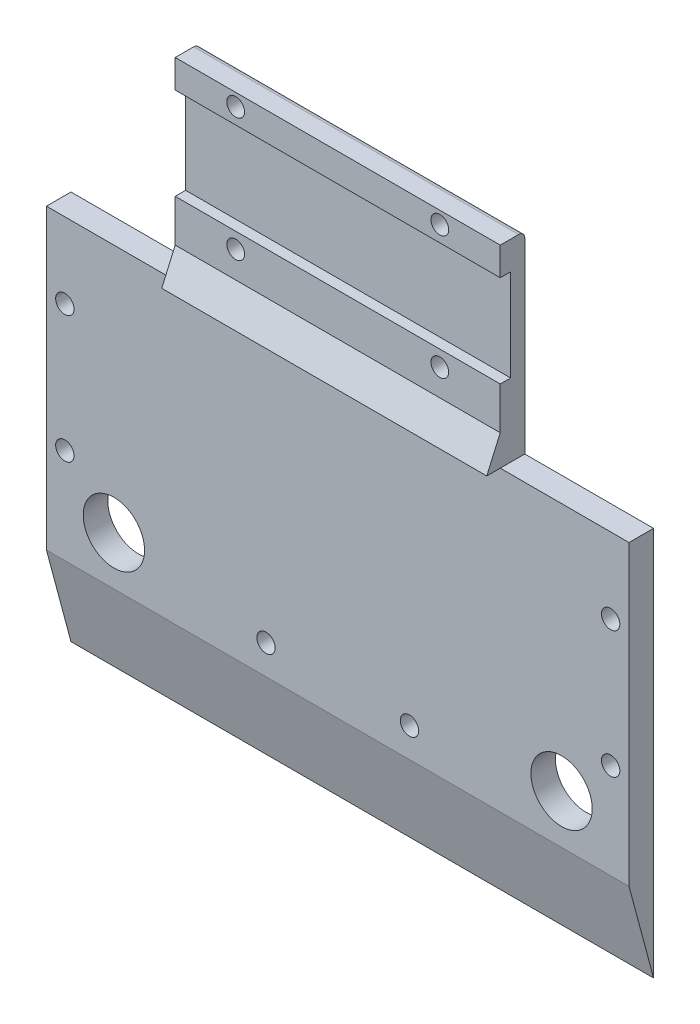
ISO-10303-21;
HEADER;
FILE_DESCRIPTION(('STEP AP214'),'2;1');
FILE_NAME('part.step','',(''),(''),'','','');
FILE_SCHEMA(('AUTOMOTIVE_DESIGN { 1 0 10303 214 1 1 1 1 }'));
ENDSEC;
DATA;
#1=APPLICATION_CONTEXT('core data for automotive mechanical design processes');
#2=APPLICATION_PROTOCOL_DEFINITION('international standard','automotive_design',2000,#1);
#3=PRODUCT_CONTEXT('',#1,'mechanical');
#4=PRODUCT('Part','Part','',(#3));
#5=PRODUCT_RELATED_PRODUCT_CATEGORY('part','',(#4));
#6=PRODUCT_DEFINITION_FORMATION('','',#4);
#7=PRODUCT_DEFINITION_CONTEXT('part definition',#1,'design');
#8=PRODUCT_DEFINITION('design','',#6,#7);
#9=PRODUCT_DEFINITION_SHAPE('','',#8);
#10=(LENGTH_UNIT() NAMED_UNIT(*) SI_UNIT(.MILLI.,.METRE.));
#11=(NAMED_UNIT(*) PLANE_ANGLE_UNIT() SI_UNIT($,.RADIAN.));
#12=(NAMED_UNIT(*) SI_UNIT($,.STERADIAN.) SOLID_ANGLE_UNIT());
#13=UNCERTAINTY_MEASURE_WITH_UNIT(LENGTH_MEASURE(1.E-05),#10,'distance_accuracy_value','');
#14=(GEOMETRIC_REPRESENTATION_CONTEXT(3) GLOBAL_UNCERTAINTY_ASSIGNED_CONTEXT((#13)) GLOBAL_UNIT_ASSIGNED_CONTEXT((#10,
#11,#12)) REPRESENTATION_CONTEXT('',''));
#15=CARTESIAN_POINT('',(0.,0.,0.));
#16=DIRECTION('',(0.,0.,1.));
#17=DIRECTION('',(1.,0.,0.));
#18=AXIS2_PLACEMENT_3D('',#15,#16,#17);
#19=CARTESIAN_POINT('',(0.,0.,4.));
#20=DIRECTION('',(0.,0.,1.));
#21=DIRECTION('',(1.,0.,0.));
#22=AXIS2_PLACEMENT_3D('',#19,#20,#21);
#23=PLANE('',#22);
#24=CARTESIAN_POINT('',(12.2768575673469,-46.5235823702513,4.));
#25=DIRECTION('',(0.,0.,1.));
#26=DIRECTION('',(1.,0.,0.));
#27=AXIS2_PLACEMENT_3D('',#24,#25,#26);
#28=CIRCLE('',#27,1.5);
#29=CARTESIAN_POINT('',(13.7768575673469,-46.5235823702513,4.));
#30=VERTEX_POINT('',#29);
#31=EDGE_CURVE('E321',#30,#30,#28,.T.);
#32=ORIENTED_EDGE('',*,*,#31,.F.);
#33=EDGE_LOOP('',(#32));
#34=FACE_BOUND('',#33,.T.);
#35=CARTESIAN_POINT('',(45.0768575673469,-57.2765214766598,4.));
#36=DIRECTION('',(0.,0.,1.));
#37=DIRECTION('',(1.,0.,0.));
#38=AXIS2_PLACEMENT_3D('',#35,#36,#37);
#39=CIRCLE('',#38,1.5);
#40=CARTESIAN_POINT('',(46.5768575673469,-57.2765214766598,4.));
#41=VERTEX_POINT('',#40);
#42=EDGE_CURVE('E325',#41,#41,#39,.T.);
#43=ORIENTED_EDGE('',*,*,#42,.F.);
#44=EDGE_LOOP('',(#43));
#45=FACE_BOUND('',#44,.T.);
#46=CARTESIAN_POINT('',(68.4768575673469,-57.2765214766598,4.));
#47=DIRECTION('',(0.,0.,1.));
#48=DIRECTION('',(-1.,0.,0.));
#49=AXIS2_PLACEMENT_3D('',#46,#47,#48);
#50=CIRCLE('',#49,1.50000000000001);
#51=CARTESIAN_POINT('',(66.9768575673469,-57.2765214766598,4.));
#52=VERTEX_POINT('',#51);
#53=EDGE_CURVE('E329',#52,#52,#50,.T.);
#54=ORIENTED_EDGE('',*,*,#53,.F.);
#55=EDGE_LOOP('',(#54));
#56=FACE_BOUND('',#55,.T.);
#57=CARTESIAN_POINT('',(101.276857567347,-25.8235823702513,4.));
#58=DIRECTION('',(0.,0.,1.));
#59=DIRECTION('',(-1.,0.,0.));
#60=AXIS2_PLACEMENT_3D('',#57,#58,#59);
#61=CIRCLE('',#60,1.50000000000003);
#62=CARTESIAN_POINT('',(99.7768575673469,-25.8235823702513,4.));
#63=VERTEX_POINT('',#62);
#64=EDGE_CURVE('E333',#63,#63,#61,.T.);
#65=ORIENTED_EDGE('',*,*,#64,.F.);
#66=EDGE_LOOP('',(#65));
#67=FACE_BOUND('',#66,.T.);
#68=CARTESIAN_POINT('',(101.276857567347,-46.5235823702513,4.));
#69=DIRECTION('',(0.,0.,1.));
#70=DIRECTION('',(-1.,0.,0.));
#71=AXIS2_PLACEMENT_3D('',#68,#69,#70);
#72=CIRCLE('',#71,1.50000000000001);
#73=CARTESIAN_POINT('',(99.7768575673469,-46.5235823702513,4.));
#74=VERTEX_POINT('',#73);
#75=EDGE_CURVE('E337',#74,#74,#72,.T.);
#76=ORIENTED_EDGE('',*,*,#75,.F.);
#77=EDGE_LOOP('',(#76));
#78=FACE_BOUND('',#77,.T.);
#79=CARTESIAN_POINT('',(12.2768575673469,-25.8235823702513,4.));
#80=DIRECTION('',(0.,0.,1.));
#81=DIRECTION('',(1.,0.,0.));
#82=AXIS2_PLACEMENT_3D('',#79,#80,#81);
#83=CIRCLE('',#82,1.5);
#84=CARTESIAN_POINT('',(13.7768575673469,-25.8235823702513,4.));
#85=VERTEX_POINT('',#84);
#86=EDGE_CURVE('E184',#85,#85,#83,.T.);
#87=ORIENTED_EDGE('',*,*,#86,.F.);
#88=EDGE_LOOP('',(#87));
#89=FACE_BOUND('',#88,.T.);
#90=DIRECTION('',(-1.,0.,0.));
#91=VECTOR('',#90,1.);
#92=CARTESIAN_POINT('',(83.2768575673469,-13.5235823702513,4.));
#93=LINE('',#92,#91);
#94=CARTESIAN_POINT('',(83.2768575673469,-13.5235823702513,4.));
#95=VERTEX_POINT('',#94);
#96=CARTESIAN_POINT('',(30.2768575673469,-13.5235823702513,4.));
#97=VERTEX_POINT('',#96);
#98=EDGE_CURVE('E346',#95,#97,#93,.T.);
#99=ORIENTED_EDGE('',*,*,#98,.T.);
#100=DIRECTION('',(1.,0.,0.));
#101=VECTOR('',#100,1.);
#102=CARTESIAN_POINT('',(9.2768575673469,-13.5235823702513,4.));
#103=LINE('',#102,#101);
#104=CARTESIAN_POINT('',(9.2768575673469,-13.5235823702513,4.));
#105=VERTEX_POINT('',#104);
#106=EDGE_CURVE('E390',#105,#97,#103,.T.);
#107=ORIENTED_EDGE('',*,*,#106,.F.);
#108=DIRECTION('',(0.,-1.,0.));
#109=VECTOR('',#108,1.);
#110=CARTESIAN_POINT('',(9.2768575673469,17.9764176297487,4.));
#111=LINE('',#110,#109);
#112=CARTESIAN_POINT('',(9.2768575673469,-62.0765214766598,4.));
#113=VERTEX_POINT('',#112);
#114=EDGE_CURVE('E416',#105,#113,#111,.T.);
#115=ORIENTED_EDGE('',*,*,#114,.T.);
#116=DIRECTION('',(-1.,0.,0.));
#117=VECTOR('',#116,1.);
#118=CARTESIAN_POINT('',(109.276857567347,-62.0765214766598,4.));
#119=LINE('',#118,#117);
#120=CARTESIAN_POINT('',(104.276857567347,-62.0765214766598,4.));
#121=VERTEX_POINT('',#120);
#122=EDGE_CURVE('E409',#121,#113,#119,.T.);
#123=ORIENTED_EDGE('',*,*,#122,.F.);
#124=DIRECTION('',(0.,-1.,0.));
#125=VECTOR('',#124,1.);
#126=CARTESIAN_POINT('',(104.276857567347,17.9764176297487,4.));
#127=LINE('',#126,#125);
#128=CARTESIAN_POINT('',(104.276857567347,-13.5235823702513,4.));
#129=VERTEX_POINT('',#128);
#130=EDGE_CURVE('E418',#129,#121,#127,.T.);
#131=ORIENTED_EDGE('',*,*,#130,.F.);
#132=DIRECTION('',(1.,0.,0.));
#133=VECTOR('',#132,1.);
#134=CARTESIAN_POINT('',(104.276857567347,-13.5235823702513,4.));
#135=LINE('',#134,#133);
#136=EDGE_CURVE('E384',#95,#129,#135,.T.);
#137=ORIENTED_EDGE('',*,*,#136,.F.);
#138=EDGE_LOOP('',(#99,#107,#115,#123,#131,#137));
#139=FACE_BOUND('',#138,.T.);
#140=CARTESIAN_POINT('',(20.2768575673469,-54.130923868787,4.));
#141=DIRECTION('',(0.,0.,1.));
#142=DIRECTION('',(1.,0.,0.));
#143=AXIS2_PLACEMENT_3D('',#140,#141,#142);
#144=CIRCLE('',#143,5.);
#145=CARTESIAN_POINT('',(25.2768575673469,-54.130923868787,4.));
#146=VERTEX_POINT('',#145);
#147=EDGE_CURVE('E351',#146,#146,#144,.T.);
#148=ORIENTED_EDGE('',*,*,#147,.F.);
#149=EDGE_LOOP('',(#148));
#150=FACE_BOUND('',#149,.T.);
#151=CARTESIAN_POINT('',(93.2768575673469,-54.130923868787,4.));
#152=DIRECTION('',(0.,0.,1.));
#153=DIRECTION('',(1.,0.,0.));
#154=AXIS2_PLACEMENT_3D('',#151,#152,#153);
#155=CIRCLE('',#154,5.00000000000001);
#156=CARTESIAN_POINT('',(98.2768575673469,-54.130923868787,4.));
#157=VERTEX_POINT('',#156);
#158=EDGE_CURVE('E354',#157,#157,#155,.T.);
#159=ORIENTED_EDGE('',*,*,#158,.F.);
#160=EDGE_LOOP('',(#159));
#161=FACE_BOUND('',#160,.T.);
#162=ADVANCED_FACE('F35',(#34,#45,#56,#67,#78,#89,#139,#150,#161),#23,.T.);
#163=CARTESIAN_POINT('',(40.1296773133988,-4.18241963774204,4.));
#164=DIRECTION('',(0.,0.,1.));
#165=DIRECTION('',(1.,0.,0.));
#166=AXIS2_PLACEMENT_3D('',#163,#164,#165);
#167=CIRCLE('',#166,1.45000000000001);
#168=CARTESIAN_POINT('',(41.5796773133988,-4.18241963774204,4.));
#169=VERTEX_POINT('',#168);
#170=EDGE_CURVE('E482',#169,#169,#167,.T.);
#171=ORIENTED_EDGE('',*,*,#170,.F.);
#172=EDGE_LOOP('',(#171));
#173=FACE_BOUND('',#172,.T.);
#174=CARTESIAN_POINT('',(73.4240378212949,-4.18241963774208,4.));
#175=DIRECTION('',(0.,0.,1.));
#176=DIRECTION('',(1.,0.,0.));
#177=AXIS2_PLACEMENT_3D('',#174,#175,#176);
#178=CIRCLE('',#177,1.45);
#179=CARTESIAN_POINT('',(74.8740378212949,-4.18241963774208,4.));
#180=VERTEX_POINT('',#179);
#181=EDGE_CURVE('E485',#180,#180,#178,.T.);
#182=ORIENTED_EDGE('',*,*,#181,.F.);
#183=EDGE_LOOP('',(#182));
#184=FACE_BOUND('',#183,.T.);
#185=DIRECTION('',(-1.,0.,0.));
#186=VECTOR('',#185,1.);
#187=CARTESIAN_POINT('',(83.2768575673469,-8.52358237025131,4.));
#188=LINE('',#187,#186);
#189=CARTESIAN_POINT('',(83.2768575673469,-8.52358237025131,4.));
#190=VERTEX_POINT('',#189);
#191=CARTESIAN_POINT('',(30.2768575673469,-8.52358237025132,4.));
#192=VERTEX_POINT('',#191);
#193=EDGE_CURVE('E454',#190,#192,#188,.T.);
#194=ORIENTED_EDGE('',*,*,#193,.F.);
#195=DIRECTION('',(0.,-1.,0.));
#196=VECTOR('',#195,1.);
#197=CARTESIAN_POINT('',(83.2768575673469,17.9764176297487,4.));
#198=LINE('',#197,#196);
#199=CARTESIAN_POINT('',(83.2768575673469,-1.63256851525397,4.));
#200=VERTEX_POINT('',#199);
#201=EDGE_CURVE('E380',#200,#190,#198,.T.);
#202=ORIENTED_EDGE('',*,*,#201,.F.);
#203=DIRECTION('',(1.,0.,0.));
#204=VECTOR('',#203,1.);
#205=CARTESIAN_POINT('',(0.,-1.63256851525397,4.));
#206=LINE('',#205,#204);
#207=CARTESIAN_POINT('',(30.2768575673469,-1.63256851525397,4.));
#208=VERTEX_POINT('',#207);
#209=EDGE_CURVE('E378',#208,#200,#206,.T.);
#210=ORIENTED_EDGE('',*,*,#209,.F.);
#211=DIRECTION('',(0.,1.,0.));
#212=VECTOR('',#211,1.);
#213=CARTESIAN_POINT('',(30.2768575673469,17.9764176297487,4.));
#214=LINE('',#213,#212);
#215=EDGE_CURVE('E398',#192,#208,#214,.T.);
#216=ORIENTED_EDGE('',*,*,#215,.F.);
#217=EDGE_LOOP('',(#194,#202,#210,#216));
#218=FACE_BOUND('',#217,.T.);
#219=ADVANCED_FACE('F294',(#173,#184,#218),#23,.T.);
#220=CARTESIAN_POINT('',(9.2768575673469,17.9764176297487,4.));
#221=DIRECTION('',(1.,0.,0.));
#222=DIRECTION('',(0.,1.,0.));
#223=AXIS2_PLACEMENT_3D('',#220,#221,#222);
#224=PLANE('',#223);
#225=ORIENTED_EDGE('',*,*,#114,.F.);
#226=DIRECTION('',(0.,0.,1.));
#227=VECTOR('',#226,1.);
#228=CARTESIAN_POINT('',(9.2768575673469,-13.5235823702513,-96.));
#229=LINE('',#228,#227);
#230=CARTESIAN_POINT('',(9.2768575673469,-13.5235823702513,0.));
#231=VERTEX_POINT('',#230);
#232=EDGE_CURVE('E400',#231,#105,#229,.T.);
#233=ORIENTED_EDGE('',*,*,#232,.F.);
#234=DIRECTION('',(0.,-1.,0.));
#235=VECTOR('',#234,1.);
#236=CARTESIAN_POINT('',(9.2768575673469,17.9764176297487,0.));
#237=LINE('',#236,#235);
#238=CARTESIAN_POINT('',(9.27685756734691,-77.0235823702513,0.));
#239=VERTEX_POINT('',#238);
#240=EDGE_CURVE('E415',#231,#239,#237,.T.);
#241=ORIENTED_EDGE('',*,*,#240,.T.);
#242=DIRECTION('',(0.,0.966007418610938,0.258514346195006));
#243=VECTOR('',#242,1.);
#244=CARTESIAN_POINT('',(9.2768575673469,-5.14746037548002,19.2348509199124));
#245=LINE('',#244,#243);
#246=EDGE_CURVE('E403',#239,#113,#245,.T.);
#247=ORIENTED_EDGE('',*,*,#246,.T.);
#248=EDGE_LOOP('',(#225,#233,#241,#247));
#249=FACE_BOUND('',#248,.T.);
#250=ADVANCED_FACE('F302',(#249),#224,.F.);
#251=CARTESIAN_POINT('',(104.276857567347,17.9764176297487,4.));
#252=DIRECTION('',(1.,0.,0.));
#253=DIRECTION('',(0.,1.,0.));
#254=AXIS2_PLACEMENT_3D('',#251,#252,#253);
#255=PLANE('',#254);
#256=DIRECTION('',(0.,0.,1.));
#257=VECTOR('',#256,1.);
#258=CARTESIAN_POINT('',(104.276857567347,-13.5235823702513,-96.));
#259=LINE('',#258,#257);
#260=CARTESIAN_POINT('',(104.276857567347,-13.5235823702513,0.));
#261=VERTEX_POINT('',#260);
#262=EDGE_CURVE('E387',#261,#129,#259,.T.);
#263=ORIENTED_EDGE('',*,*,#262,.T.);
#264=ORIENTED_EDGE('',*,*,#130,.T.);
#265=DIRECTION('',(0.,-0.966007418610939,-0.258514346195006));
#266=VECTOR('',#265,1.);
#267=CARTESIAN_POINT('',(104.276857567347,12.6265063517956,23.991362411719));
#268=LINE('',#267,#266);
#269=CARTESIAN_POINT('',(104.276857567347,-77.0235823702513,0.));
#270=VERTEX_POINT('',#269);
#271=EDGE_CURVE('E412',#121,#270,#268,.T.);
#272=ORIENTED_EDGE('',*,*,#271,.T.);
#273=DIRECTION('',(0.,-1.,0.));
#274=VECTOR('',#273,1.);
#275=CARTESIAN_POINT('',(104.276857567347,17.9764176297487,0.));
#276=LINE('',#275,#274);
#277=EDGE_CURVE('E419',#261,#270,#276,.T.);
#278=ORIENTED_EDGE('',*,*,#277,.F.);
#279=EDGE_LOOP('',(#263,#264,#272,#278));
#280=FACE_BOUND('',#279,.T.);
#281=ADVANCED_FACE('F292',(#280),#255,.T.);
#282=CARTESIAN_POINT('',(73.4240378212949,15.9352548972394,4.));
#283=DIRECTION('',(0.,0.,1.));
#284=DIRECTION('',(1.,0.,0.));
#285=AXIS2_PLACEMENT_3D('',#282,#283,#284);
#286=CIRCLE('',#285,1.45);
#287=CARTESIAN_POINT('',(74.8740378212949,15.9352548972394,4.));
#288=VERTEX_POINT('',#287);
#289=EDGE_CURVE('E481',#288,#288,#286,.T.);
#290=ORIENTED_EDGE('',*,*,#289,.F.);
#291=EDGE_LOOP('',(#290));
#292=FACE_BOUND('',#291,.T.);
#293=CARTESIAN_POINT('',(40.1296773133989,15.9352548972394,4.));
#294=DIRECTION('',(0.,0.,1.));
#295=DIRECTION('',(1.,0.,0.));
#296=AXIS2_PLACEMENT_3D('',#293,#294,#295);
#297=CIRCLE('',#296,1.44999999999999);
#298=CARTESIAN_POINT('',(41.5796773133988,15.9352548972394,4.));
#299=VERTEX_POINT('',#298);
#300=EDGE_CURVE('E166',#299,#299,#297,.T.);
#301=ORIENTED_EDGE('',*,*,#300,.F.);
#302=EDGE_LOOP('',(#301));
#303=FACE_BOUND('',#302,.T.);
#304=DIRECTION('',(-1.,0.,0.));
#305=VECTOR('',#304,1.);
#306=CARTESIAN_POINT('',(0.,13.367431484746,4.));
#307=LINE('',#306,#305);
#308=CARTESIAN_POINT('',(83.2768575673469,13.367431484746,4.));
#309=VERTEX_POINT('',#308);
#310=CARTESIAN_POINT('',(30.2768575673469,13.367431484746,4.));
#311=VERTEX_POINT('',#310);
#312=EDGE_CURVE('E375',#309,#311,#307,.T.);
#313=ORIENTED_EDGE('',*,*,#312,.F.);
#314=CARTESIAN_POINT('',(83.2768575673469,17.9764176297487,4.));
#315=VERTEX_POINT('',#314);
#316=EDGE_CURVE('E381',#315,#309,#198,.T.);
#317=ORIENTED_EDGE('',*,*,#316,.F.);
#318=DIRECTION('',(1.,0.,0.));
#319=VECTOR('',#318,1.);
#320=CARTESIAN_POINT('',(9.2768575673469,17.9764176297487,4.));
#321=LINE('',#320,#319);
#322=CARTESIAN_POINT('',(30.2768575673469,17.9764176297487,4.));
#323=VERTEX_POINT('',#322);
#324=EDGE_CURVE('E421',#323,#315,#321,.T.);
#325=ORIENTED_EDGE('',*,*,#324,.F.);
#326=EDGE_CURVE('E397',#311,#323,#214,.T.);
#327=ORIENTED_EDGE('',*,*,#326,.F.);
#328=EDGE_LOOP('',(#313,#317,#325,#327));
#329=FACE_BOUND('',#328,.T.);
#330=ADVANCED_FACE('F288',(#292,#303,#329),#23,.T.);
#331=CARTESIAN_POINT('',(9.2768575673469,17.9764176297487,4.));
#332=DIRECTION('',(0.,1.,0.));
#333=DIRECTION('',(-1.,0.,0.));
#334=AXIS2_PLACEMENT_3D('',#331,#332,#333);
#335=PLANE('',#334);
#336=DIRECTION('',(0.,0.,1.));
#337=VECTOR('',#336,1.);
#338=CARTESIAN_POINT('',(83.2768575673469,17.9764176297487,-96.));
#339=LINE('',#338,#337);
#340=CARTESIAN_POINT('',(83.2768575673469,17.9764176297487,1.));
#341=VERTEX_POINT('',#340);
#342=EDGE_CURVE('E386',#341,#315,#339,.T.);
#343=ORIENTED_EDGE('',*,*,#342,.F.);
#344=DIRECTION('',(1.,0.,0.));
#345=VECTOR('',#344,1.);
#346=CARTESIAN_POINT('',(30.2768575673469,17.9764176297487,1.));
#347=LINE('',#346,#345);
#348=CARTESIAN_POINT('',(30.2768575673469,17.9764176297487,1.));
#349=VERTEX_POINT('',#348);
#350=EDGE_CURVE('E177',#341,#349,#347,.F.);
#351=ORIENTED_EDGE('',*,*,#350,.T.);
#352=DIRECTION('',(0.,0.,1.));
#353=VECTOR('',#352,1.);
#354=CARTESIAN_POINT('',(30.2768575673469,17.9764176297487,-96.));
#355=LINE('',#354,#353);
#356=EDGE_CURVE('E401',#349,#323,#355,.T.);
#357=ORIENTED_EDGE('',*,*,#356,.T.);
#358=ORIENTED_EDGE('',*,*,#324,.T.);
#359=EDGE_LOOP('',(#343,#351,#357,#358));
#360=FACE_BOUND('',#359,.T.);
#361=ADVANCED_FACE('F291',(#360),#335,.T.);
#362=CARTESIAN_POINT('',(0.,0.,0.));
#363=DIRECTION('',(0.,0.,1.));
#364=DIRECTION('',(1.,0.,0.));
#365=AXIS2_PLACEMENT_3D('',#362,#363,#364);
#366=PLANE('',#365);
#367=CARTESIAN_POINT('',(40.1296773133988,-4.18241963774204,0.));
#368=DIRECTION('',(0.,0.,1.));
#369=DIRECTION('',(1.,0.,0.));
#370=AXIS2_PLACEMENT_3D('',#367,#368,#369);
#371=CIRCLE('',#370,1.45000000000001);
#372=CARTESIAN_POINT('',(41.5796773133988,-4.18241963774204,0.));
#373=VERTEX_POINT('',#372);
#374=EDGE_CURVE('E40',#373,#373,#371,.T.);
#375=ORIENTED_EDGE('',*,*,#374,.T.);
#376=EDGE_LOOP('',(#375));
#377=FACE_BOUND('',#376,.T.);
#378=CARTESIAN_POINT('',(73.4240378212949,-4.18241963774208,0.));
#379=DIRECTION('',(0.,0.,1.));
#380=DIRECTION('',(1.,0.,0.));
#381=AXIS2_PLACEMENT_3D('',#378,#379,#380);
#382=CIRCLE('',#381,1.45);
#383=CARTESIAN_POINT('',(74.8740378212949,-4.18241963774208,0.));
#384=VERTEX_POINT('',#383);
#385=EDGE_CURVE('E477',#384,#384,#382,.T.);
#386=ORIENTED_EDGE('',*,*,#385,.T.);
#387=EDGE_LOOP('',(#386));
#388=FACE_BOUND('',#387,.T.);
#389=CARTESIAN_POINT('',(12.2768575673469,-46.5235823702513,0.));
#390=DIRECTION('',(0.,0.,1.));
#391=DIRECTION('',(1.,0.,0.));
#392=AXIS2_PLACEMENT_3D('',#389,#390,#391);
#393=CIRCLE('',#392,1.5);
#394=CARTESIAN_POINT('',(13.7768575673469,-46.5235823702513,0.));
#395=VERTEX_POINT('',#394);
#396=EDGE_CURVE('E196',#395,#395,#393,.T.);
#397=ORIENTED_EDGE('',*,*,#396,.T.);
#398=EDGE_LOOP('',(#397));
#399=FACE_BOUND('',#398,.T.);
#400=CARTESIAN_POINT('',(45.0768575673469,-57.2765214766598,0.));
#401=DIRECTION('',(0.,0.,1.));
#402=DIRECTION('',(1.,0.,0.));
#403=AXIS2_PLACEMENT_3D('',#400,#401,#402);
#404=CIRCLE('',#403,1.5);
#405=CARTESIAN_POINT('',(46.5768575673469,-57.2765214766598,0.));
#406=VERTEX_POINT('',#405);
#407=EDGE_CURVE('E193',#406,#406,#404,.T.);
#408=ORIENTED_EDGE('',*,*,#407,.T.);
#409=EDGE_LOOP('',(#408));
#410=FACE_BOUND('',#409,.T.);
#411=CARTESIAN_POINT('',(68.4768575673469,-57.2765214766598,0.));
#412=DIRECTION('',(0.,0.,1.));
#413=DIRECTION('',(1.,0.,0.));
#414=AXIS2_PLACEMENT_3D('',#411,#412,#413);
#415=CIRCLE('',#414,1.50000000000001);
#416=CARTESIAN_POINT('',(69.9768575673469,-57.2765214766598,0.));
#417=VERTEX_POINT('',#416);
#418=EDGE_CURVE('E190',#417,#417,#415,.T.);
#419=ORIENTED_EDGE('',*,*,#418,.T.);
#420=EDGE_LOOP('',(#419));
#421=FACE_BOUND('',#420,.T.);
#422=CARTESIAN_POINT('',(101.276857567347,-25.8235823702513,0.));
#423=DIRECTION('',(0.,0.,1.));
#424=DIRECTION('',(1.,0.,0.));
#425=AXIS2_PLACEMENT_3D('',#422,#423,#424);
#426=CIRCLE('',#425,1.50000000000003);
#427=CARTESIAN_POINT('',(102.776857567347,-25.8235823702513,0.));
#428=VERTEX_POINT('',#427);
#429=EDGE_CURVE('E187',#428,#428,#426,.T.);
#430=ORIENTED_EDGE('',*,*,#429,.T.);
#431=EDGE_LOOP('',(#430));
#432=FACE_BOUND('',#431,.T.);
#433=CARTESIAN_POINT('',(101.276857567347,-46.5235823702513,0.));
#434=DIRECTION('',(0.,0.,1.));
#435=DIRECTION('',(1.,0.,0.));
#436=AXIS2_PLACEMENT_3D('',#433,#434,#435);
#437=CIRCLE('',#436,1.50000000000001);
#438=CARTESIAN_POINT('',(102.776857567347,-46.5235823702513,0.));
#439=VERTEX_POINT('',#438);
#440=EDGE_CURVE('E183',#439,#439,#437,.T.);
#441=ORIENTED_EDGE('',*,*,#440,.T.);
#442=EDGE_LOOP('',(#441));
#443=FACE_BOUND('',#442,.T.);
#444=CARTESIAN_POINT('',(12.2768575673469,-25.8235823702513,0.));
#445=DIRECTION('',(0.,0.,1.));
#446=DIRECTION('',(1.,0.,0.));
#447=AXIS2_PLACEMENT_3D('',#444,#445,#446);
#448=CIRCLE('',#447,1.5);
#449=CARTESIAN_POINT('',(13.7768575673469,-25.8235823702513,0.));
#450=VERTEX_POINT('',#449);
#451=EDGE_CURVE('E180',#450,#450,#448,.T.);
#452=ORIENTED_EDGE('',*,*,#451,.T.);
#453=EDGE_LOOP('',(#452));
#454=FACE_BOUND('',#453,.T.);
#455=CARTESIAN_POINT('',(20.2768575673469,-54.130923868787,0.));
#456=DIRECTION('',(0.,0.,-1.));
#457=DIRECTION('',(-1.,0.,0.));
#458=AXIS2_PLACEMENT_3D('',#455,#456,#457);
#459=CIRCLE('',#458,5.);
#460=CARTESIAN_POINT('',(15.2768575673469,-54.130923868787,0.));
#461=VERTEX_POINT('',#460);
#462=EDGE_CURVE('E355',#461,#461,#459,.T.);
#463=ORIENTED_EDGE('',*,*,#462,.F.);
#464=EDGE_LOOP('',(#463));
#465=FACE_BOUND('',#464,.T.);
#466=CARTESIAN_POINT('',(93.2768575673469,-54.130923868787,0.));
#467=DIRECTION('',(0.,0.,-1.));
#468=DIRECTION('',(-1.,0.,0.));
#469=AXIS2_PLACEMENT_3D('',#466,#467,#468);
#470=CIRCLE('',#469,5.00000000000001);
#471=CARTESIAN_POINT('',(88.2768575673469,-54.130923868787,0.));
#472=VERTEX_POINT('',#471);
#473=EDGE_CURVE('E360',#472,#472,#470,.T.);
#474=ORIENTED_EDGE('',*,*,#473,.F.);
#475=EDGE_LOOP('',(#474));
#476=FACE_BOUND('',#475,.T.);
#477=DIRECTION('',(1.,0.,0.));
#478=VECTOR('',#477,1.);
#479=CARTESIAN_POINT('',(83.2768575673469,16.9764176297487,0.));
#480=LINE('',#479,#478);
#481=CARTESIAN_POINT('',(41.1388750960132,16.9764176297487,0.));
#482=VERTEX_POINT('',#481);
#483=CARTESIAN_POINT('',(72.4148400386805,16.9764176297487,0.));
#484=VERTEX_POINT('',#483);
#485=EDGE_CURVE('E163',#482,#484,#480,.T.);
#486=ORIENTED_EDGE('',*,*,#485,.T.);
#487=CARTESIAN_POINT('',(73.4240378212949,15.9352548972394,0.));
#488=DIRECTION('',(0.,0.,1.));
#489=DIRECTION('',(1.,0.,0.));
#490=AXIS2_PLACEMENT_3D('',#487,#488,#489);
#491=CIRCLE('',#490,1.45);
#492=CARTESIAN_POINT('',(74.4332356039093,16.9764176297487,0.));
#493=VERTEX_POINT('',#492);
#494=EDGE_CURVE('E51',#484,#493,#491,.T.);
#495=ORIENTED_EDGE('',*,*,#494,.T.);
#496=CARTESIAN_POINT('',(83.2768575673469,16.9764176297487,0.));
#497=VERTEX_POINT('',#496);
#498=EDGE_CURVE('E169',#493,#497,#480,.T.);
#499=ORIENTED_EDGE('',*,*,#498,.T.);
#500=DIRECTION('',(0.,-1.,0.));
#501=VECTOR('',#500,1.);
#502=CARTESIAN_POINT('',(83.2768575673469,0.,0.));
#503=LINE('',#502,#501);
#504=CARTESIAN_POINT('',(83.2768575673469,-13.5235823702513,0.));
#505=VERTEX_POINT('',#504);
#506=EDGE_CURVE('E434',#497,#505,#503,.T.);
#507=ORIENTED_EDGE('',*,*,#506,.T.);
#508=DIRECTION('',(1.,0.,0.));
#509=VECTOR('',#508,1.);
#510=CARTESIAN_POINT('',(0.,-13.5235823702513,0.));
#511=LINE('',#510,#509);
#512=EDGE_CURVE('E436',#505,#261,#511,.T.);
#513=ORIENTED_EDGE('',*,*,#512,.T.);
#514=ORIENTED_EDGE('',*,*,#277,.T.);
#515=DIRECTION('',(1.,0.,0.));
#516=VECTOR('',#515,1.);
#517=CARTESIAN_POINT('',(9.27685756734691,-77.0235823702513,0.));
#518=LINE('',#517,#516);
#519=EDGE_CURVE('E426',#239,#270,#518,.T.);
#520=ORIENTED_EDGE('',*,*,#519,.F.);
#521=ORIENTED_EDGE('',*,*,#240,.F.);
#522=DIRECTION('',(1.,0.,0.));
#523=VECTOR('',#522,1.);
#524=CARTESIAN_POINT('',(0.,-13.5235823702513,0.));
#525=LINE('',#524,#523);
#526=CARTESIAN_POINT('',(30.2768575673469,-13.5235823702513,0.));
#527=VERTEX_POINT('',#526);
#528=EDGE_CURVE('E424',#231,#527,#525,.T.);
#529=ORIENTED_EDGE('',*,*,#528,.T.);
#530=DIRECTION('',(0.,1.,0.));
#531=VECTOR('',#530,1.);
#532=CARTESIAN_POINT('',(30.2768575673469,0.,0.));
#533=LINE('',#532,#531);
#534=CARTESIAN_POINT('',(30.2768575673469,16.9764176297487,0.));
#535=VERTEX_POINT('',#534);
#536=EDGE_CURVE('E432',#527,#535,#533,.T.);
#537=ORIENTED_EDGE('',*,*,#536,.T.);
#538=CARTESIAN_POINT('',(39.1204795307845,16.9764176297487,0.));
#539=VERTEX_POINT('',#538);
#540=EDGE_CURVE('E165',#535,#539,#480,.T.);
#541=ORIENTED_EDGE('',*,*,#540,.T.);
#542=CARTESIAN_POINT('',(40.1296773133989,15.9352548972394,0.));
#543=DIRECTION('',(0.,0.,1.));
#544=DIRECTION('',(1.,0.,0.));
#545=AXIS2_PLACEMENT_3D('',#542,#543,#544);
#546=CIRCLE('',#545,1.44999999999999);
#547=EDGE_CURVE('E58',#539,#482,#546,.T.);
#548=ORIENTED_EDGE('',*,*,#547,.T.);
#549=EDGE_LOOP('',(#486,#495,#499,#507,#513,#514,#520,#521,#529,#537,#541,#548));
#550=FACE_BOUND('',#549,.T.);
#551=ADVANCED_FACE('F162',(#377,#388,#399,#410,#421,#432,#443,#454,#465,#476,#550),#366,.F.);
#552=CARTESIAN_POINT('',(109.276857567347,-5.14746037548002,19.2348509199124));
#553=DIRECTION('',(0.,-0.258514346195006,0.966007418610938));
#554=DIRECTION('',(0.,-0.966007418610939,-0.258514346195006));
#555=AXIS2_PLACEMENT_3D('',#552,#553,#554);
#556=PLANE('',#555);
#557=ORIENTED_EDGE('',*,*,#122,.T.);
#558=ORIENTED_EDGE('',*,*,#246,.F.);
#559=ORIENTED_EDGE('',*,*,#519,.T.);
#560=ORIENTED_EDGE('',*,*,#271,.F.);
#561=EDGE_LOOP('',(#557,#558,#559,#560));
#562=FACE_BOUND('',#561,.T.);
#563=ADVANCED_FACE('F280',(#562),#556,.T.);
#564=CARTESIAN_POINT('',(30.2768575673469,17.9764176297487,-96.));
#565=DIRECTION('',(1.,0.,0.));
#566=DIRECTION('',(0.,1.,0.));
#567=AXIS2_PLACEMENT_3D('',#564,#565,#566);
#568=PLANE('',#567);
#569=ORIENTED_EDGE('',*,*,#356,.F.);
#570=CARTESIAN_POINT('',(30.2768575673469,16.9764176297487,1.));
#571=DIRECTION('',(1.,0.,0.));
#572=DIRECTION('',(0.,1.,0.));
#573=AXIS2_PLACEMENT_3D('',#570,#571,#572);
#574=CIRCLE('',#573,1.);
#575=EDGE_CURVE('E158',#349,#535,#574,.F.);
#576=ORIENTED_EDGE('',*,*,#575,.T.);
#577=ORIENTED_EDGE('',*,*,#536,.F.);
#578=DIRECTION('',(0.,0.,1.));
#579=VECTOR('',#578,1.);
#580=CARTESIAN_POINT('',(30.2768575673469,-13.5235823702513,-96.));
#581=LINE('',#580,#579);
#582=EDGE_CURVE('E404',#527,#97,#581,.T.);
#583=ORIENTED_EDGE('',*,*,#582,.T.);
#584=DIRECTION('',(0.,0.,1.));
#585=VECTOR('',#584,1.);
#586=CARTESIAN_POINT('',(30.2768575673469,-13.5235823702513,6.2));
#587=LINE('',#586,#585);
#588=CARTESIAN_POINT('',(30.2768575673469,-13.5235823702513,6.2));
#589=VERTEX_POINT('',#588);
#590=EDGE_CURVE('E198',#97,#589,#587,.T.);
#591=ORIENTED_EDGE('',*,*,#590,.T.);
#592=DIRECTION('',(0.,0.915315032422766,-0.402738614266017));
#593=VECTOR('',#592,1.);
#594=CARTESIAN_POINT('',(30.2768575673469,-8.52358237025132,4.));
#595=LINE('',#594,#593);
#596=EDGE_CURVE('E463',#589,#192,#595,.T.);
#597=ORIENTED_EDGE('',*,*,#596,.T.);
#598=ORIENTED_EDGE('',*,*,#215,.T.);
#599=DIRECTION('',(0.,0.,1.));
#600=VECTOR('',#599,1.);
#601=CARTESIAN_POINT('',(30.2768575673469,-1.63256851525397,5.30843788427662));
#602=LINE('',#601,#600);
#603=CARTESIAN_POINT('',(30.2768575673469,-1.63256851525397,2.30843788427662));
#604=VERTEX_POINT('',#603);
#605=EDGE_CURVE('E369',#604,#208,#602,.T.);
#606=ORIENTED_EDGE('',*,*,#605,.F.);
#607=DIRECTION('',(0.,-1.,0.));
#608=VECTOR('',#607,1.);
#609=CARTESIAN_POINT('',(30.2768575673469,13.367431484746,2.30843788427662));
#610=LINE('',#609,#608);
#611=CARTESIAN_POINT('',(30.2768575673469,13.367431484746,2.30843788427662));
#612=VERTEX_POINT('',#611);
#613=EDGE_CURVE('E366',#612,#604,#610,.T.);
#614=ORIENTED_EDGE('',*,*,#613,.F.);
#615=DIRECTION('',(0.,0.,-1.));
#616=VECTOR('',#615,1.);
#617=CARTESIAN_POINT('',(30.2768575673469,13.367431484746,5.30843788427662));
#618=LINE('',#617,#616);
#619=EDGE_CURVE('E357',#311,#612,#618,.T.);
#620=ORIENTED_EDGE('',*,*,#619,.F.);
#621=ORIENTED_EDGE('',*,*,#326,.T.);
#622=EDGE_LOOP('',(#569,#576,#577,#583,#591,#597,#598,#606,#614,#620,#621));
#623=FACE_BOUND('',#622,.T.);
#624=ADVANCED_FACE('F277',(#623),#568,.F.);
#625=CARTESIAN_POINT('',(9.2768575673469,-13.5235823702513,-96.));
#626=DIRECTION('',(0.,-1.,0.));
#627=DIRECTION('',(0.,0.,-1.));
#628=AXIS2_PLACEMENT_3D('',#625,#626,#627);
#629=PLANE('',#628);
#630=ORIENTED_EDGE('',*,*,#232,.T.);
#631=ORIENTED_EDGE('',*,*,#106,.T.);
#632=ORIENTED_EDGE('',*,*,#582,.F.);
#633=ORIENTED_EDGE('',*,*,#528,.F.);
#634=EDGE_LOOP('',(#630,#631,#632,#633));
#635=FACE_BOUND('',#634,.T.);
#636=ADVANCED_FACE('F272',(#635),#629,.F.);
#637=CARTESIAN_POINT('',(104.276857567347,-13.5235823702513,-96.));
#638=DIRECTION('',(0.,-1.,0.));
#639=DIRECTION('',(0.,0.,-1.));
#640=AXIS2_PLACEMENT_3D('',#637,#638,#639);
#641=PLANE('',#640);
#642=DIRECTION('',(0.,0.,1.));
#643=VECTOR('',#642,1.);
#644=CARTESIAN_POINT('',(83.2768575673469,-13.5235823702513,-96.));
#645=LINE('',#644,#643);
#646=EDGE_CURVE('E391',#505,#95,#645,.T.);
#647=ORIENTED_EDGE('',*,*,#646,.T.);
#648=ORIENTED_EDGE('',*,*,#136,.T.);
#649=ORIENTED_EDGE('',*,*,#262,.F.);
#650=ORIENTED_EDGE('',*,*,#512,.F.);
#651=EDGE_LOOP('',(#647,#648,#649,#650));
#652=FACE_BOUND('',#651,.T.);
#653=ADVANCED_FACE('F269',(#652),#641,.F.);
#654=CARTESIAN_POINT('',(83.2768575673469,17.9764176297487,-96.));
#655=DIRECTION('',(-1.,0.,0.));
#656=DIRECTION('',(0.,0.,1.));
#657=AXIS2_PLACEMENT_3D('',#654,#655,#656);
#658=PLANE('',#657);
#659=ORIENTED_EDGE('',*,*,#506,.F.);
#660=CARTESIAN_POINT('',(83.2768575673469,16.9764176297487,1.));
#661=DIRECTION('',(-1.,0.,0.));
#662=DIRECTION('',(0.,0.,1.));
#663=AXIS2_PLACEMENT_3D('',#660,#661,#662);
#664=CIRCLE('',#663,1.);
#665=EDGE_CURVE('E171',#497,#341,#664,.F.);
#666=ORIENTED_EDGE('',*,*,#665,.T.);
#667=ORIENTED_EDGE('',*,*,#342,.T.);
#668=ORIENTED_EDGE('',*,*,#316,.T.);
#669=DIRECTION('',(0.,0.,-1.));
#670=VECTOR('',#669,1.);
#671=CARTESIAN_POINT('',(83.2768575673469,13.3674314847461,-96.));
#672=LINE('',#671,#670);
#673=CARTESIAN_POINT('',(83.2768575673469,13.367431484746,2.30843788427662));
#674=VERTEX_POINT('',#673);
#675=EDGE_CURVE('E439',#309,#674,#672,.T.);
#676=ORIENTED_EDGE('',*,*,#675,.T.);
#677=DIRECTION('',(0.,-1.,0.));
#678=VECTOR('',#677,1.);
#679=CARTESIAN_POINT('',(83.2768575673469,17.9764176297487,2.30843788427662));
#680=LINE('',#679,#678);
#681=CARTESIAN_POINT('',(83.2768575673469,-1.63256851525397,2.30843788427662));
#682=VERTEX_POINT('',#681);
#683=EDGE_CURVE('E441',#674,#682,#680,.T.);
#684=ORIENTED_EDGE('',*,*,#683,.T.);
#685=DIRECTION('',(0.,0.,1.));
#686=VECTOR('',#685,1.);
#687=CARTESIAN_POINT('',(83.2768575673469,-1.63256851525399,-96.));
#688=LINE('',#687,#686);
#689=EDGE_CURVE('E172',#682,#200,#688,.T.);
#690=ORIENTED_EDGE('',*,*,#689,.T.);
#691=ORIENTED_EDGE('',*,*,#201,.T.);
#692=DIRECTION('',(0.,0.915315032422766,-0.402738614266017));
#693=VECTOR('',#692,1.);
#694=CARTESIAN_POINT('',(83.2768575673469,-8.52358237025131,4.));
#695=LINE('',#694,#693);
#696=CARTESIAN_POINT('',(83.2768575673469,-13.5235823702513,6.2));
#697=VERTEX_POINT('',#696);
#698=EDGE_CURVE('E460',#697,#190,#695,.T.);
#699=ORIENTED_EDGE('',*,*,#698,.F.);
#700=DIRECTION('',(0.,0.,1.));
#701=VECTOR('',#700,1.);
#702=CARTESIAN_POINT('',(83.2768575673469,-13.5235823702513,6.2));
#703=LINE('',#702,#701);
#704=EDGE_CURVE('E465',#95,#697,#703,.T.);
#705=ORIENTED_EDGE('',*,*,#704,.F.);
#706=ORIENTED_EDGE('',*,*,#646,.F.);
#707=EDGE_LOOP('',(#659,#666,#667,#668,#676,#684,#690,#691,#699,#705,#706));
#708=FACE_BOUND('',#707,.T.);
#709=ADVANCED_FACE('F264',(#708),#658,.F.);
#710=CARTESIAN_POINT('',(130.276857567347,13.367431484746,2.30843788427662));
#711=DIRECTION('',(0.,0.,-1.));
#712=DIRECTION('',(0.,1.,0.));
#713=AXIS2_PLACEMENT_3D('',#710,#711,#712);
#714=PLANE('',#713);
#715=DIRECTION('',(-1.,0.,0.));
#716=VECTOR('',#715,1.);
#717=CARTESIAN_POINT('',(130.276857567347,13.367431484746,2.30843788427662));
#718=LINE('',#717,#716);
#719=EDGE_CURVE('E372',#674,#612,#718,.T.);
#720=ORIENTED_EDGE('',*,*,#719,.T.);
#721=ORIENTED_EDGE('',*,*,#613,.T.);
#722=DIRECTION('',(-1.,0.,0.));
#723=VECTOR('',#722,1.);
#724=CARTESIAN_POINT('',(130.276857567347,-1.63256851525397,2.30843788427662));
#725=LINE('',#724,#723);
#726=EDGE_CURVE('E373',#682,#604,#725,.T.);
#727=ORIENTED_EDGE('',*,*,#726,.F.);
#728=ORIENTED_EDGE('',*,*,#683,.F.);
#729=EDGE_LOOP('',(#720,#721,#727,#728));
#730=FACE_BOUND('',#729,.T.);
#731=ADVANCED_FACE('F260',(#730),#714,.F.);
#732=CARTESIAN_POINT('',(130.276857567347,-1.63256851525397,5.30843788427662));
#733=DIRECTION('',(0.,-1.,0.));
#734=DIRECTION('',(0.,0.,-1.));
#735=AXIS2_PLACEMENT_3D('',#732,#733,#734);
#736=PLANE('',#735);
#737=ORIENTED_EDGE('',*,*,#209,.T.);
#738=ORIENTED_EDGE('',*,*,#689,.F.);
#739=ORIENTED_EDGE('',*,*,#726,.T.);
#740=ORIENTED_EDGE('',*,*,#605,.T.);
#741=EDGE_LOOP('',(#737,#738,#739,#740));
#742=FACE_BOUND('',#741,.T.);
#743=ADVANCED_FACE('F256',(#742),#736,.F.);
#744=CARTESIAN_POINT('',(130.276857567347,13.367431484746,5.30843788427662));
#745=DIRECTION('',(0.,1.,0.));
#746=DIRECTION('',(0.,0.,1.));
#747=AXIS2_PLACEMENT_3D('',#744,#745,#746);
#748=PLANE('',#747);
#749=ORIENTED_EDGE('',*,*,#312,.T.);
#750=ORIENTED_EDGE('',*,*,#619,.T.);
#751=ORIENTED_EDGE('',*,*,#719,.F.);
#752=ORIENTED_EDGE('',*,*,#675,.F.);
#753=EDGE_LOOP('',(#749,#750,#751,#752));
#754=FACE_BOUND('',#753,.T.);
#755=ADVANCED_FACE('F259',(#754),#748,.F.);
#756=CARTESIAN_POINT('',(0.,16.9764176297487,1.));
#757=DIRECTION('',(-1.,0.,0.));
#758=DIRECTION('',(0.,-1.,0.));
#759=AXIS2_PLACEMENT_3D('',#756,#757,#758);
#760=CYLINDRICAL_SURFACE('',#759,1.);
#761=CARTESIAN_POINT('',(72.4148400386805,16.9764176297487,0.));
#762=CARTESIAN_POINT('',(72.4455575557685,17.0061958927082,5.64891774875113E-06));
#763=CARTESIAN_POINT('',(72.4775531326593,17.0345678640148,0.00132870875120687));
#764=CARTESIAN_POINT('',(72.5437981676479,17.0882914112309,0.00591143831058029));
#765=CARTESIAN_POINT('',(72.5780447622729,17.1136467134103,0.00916868842511902));
#766=CARTESIAN_POINT('',(72.6837639394203,17.1849392481277,0.020796108476131));
#767=CARTESIAN_POINT('',(72.7582734944535,17.2261586174885,0.0310245232973839));
#768=CARTESIAN_POINT('',(72.9057290304295,17.2916207119144,0.0504214136847268));
#769=CARTESIAN_POINT('',(72.9781254779751,17.3171224357207,0.0595964541870883));
#770=CARTESIAN_POINT('',(73.1262900992204,17.3564160350253,0.0747704455675523));
#771=CARTESIAN_POINT('',(73.2020528393047,17.3702261078688,0.0807743266636995));
#772=CARTESIAN_POINT('',(73.3580721700939,17.3859539755494,0.0876585904149594));
#773=CARTESIAN_POINT('',(73.4383886378989,17.387385618356,0.0883294435061169));
#774=CARTESIAN_POINT('',(73.598051207667,17.3770002864634,0.0837248412112062));
#775=CARTESIAN_POINT('',(73.6773961815462,17.3651691591885,0.078443033765508));
#776=CARTESIAN_POINT('',(73.8281901963731,17.3298227580343,0.0643531377330181));
#777=CARTESIAN_POINT('',(73.8998309155171,17.3070184777509,0.0557652854883087));
#778=CARTESIAN_POINT('',(74.0386012746124,17.2507059729553,0.0379007786723769));
#779=CARTESIAN_POINT('',(74.1057357427496,17.2172094335168,0.0286248844857708));
#780=CARTESIAN_POINT('',(74.2173757105672,17.1502302446677,0.0147938078664164));
#781=CARTESIAN_POINT('',(74.2631948076867,17.1190527974253,0.00963861187078973));
#782=CARTESIAN_POINT('',(74.3511433630471,17.0515258435133,0.00224976917778489));
#783=CARTESIAN_POINT('',(74.3932699515796,17.0151723707714,1.83763143809637E-05));
#784=CARTESIAN_POINT('',(74.4332356039093,16.9764176297487,0.));
#785=B_SPLINE_CURVE_WITH_KNOTS('',3,(#761,#762,#763,#764,#765,#766,#767,#768,#769,#770,#771,
#772,#773,#774,#775,#776,#777,#778,#779,#780,#781,#782,#783,#784),.UNSPECIFIED.,.F.,.F.,(4,2,2,
2,2,2,2,2,2,2,2,4),(0.,0.128185176513284,0.256210334211858,0.512024411011396,0.743021750715035,
0.973658892609172,1.21331485319088,1.45322679200492,1.67934308623864,1.90521310966822,
2.07178290285515,2.23848102213303),.UNSPECIFIED.);
#786=EDGE_CURVE('E11',#484,#493,#785,.T.);
#787=ORIENTED_EDGE('',*,*,#786,.F.);
#788=ORIENTED_EDGE('',*,*,#485,.F.);
#789=CARTESIAN_POINT('',(39.1204795307845,16.9764176297487,0.));
#790=CARTESIAN_POINT('',(39.1511970478725,17.0061958927082,5.64891774894002E-06));
#791=CARTESIAN_POINT('',(39.1831926247632,17.0345678640148,0.00132870875120724));
#792=CARTESIAN_POINT('',(39.2494376597518,17.0882914112309,0.00591143831058082));
#793=CARTESIAN_POINT('',(39.2836842543768,17.1136467134103,0.00916868842511929));
#794=CARTESIAN_POINT('',(39.3894034315242,17.1849392481277,0.0207961084761306));
#795=CARTESIAN_POINT('',(39.4639129865574,17.2261586174885,0.0310245232973832));
#796=CARTESIAN_POINT('',(39.6113685225335,17.2916207119144,0.0504214136847254));
#797=CARTESIAN_POINT('',(39.683764970079,17.3171224357207,0.0595964541870865));
#798=CARTESIAN_POINT('',(39.8319295913244,17.3564160350253,0.0747704455675498));
#799=CARTESIAN_POINT('',(39.9076923314087,17.3702261078688,0.080774326663697));
#800=CARTESIAN_POINT('',(40.0637116621978,17.3859539755494,0.0876585904149564));
#801=CARTESIAN_POINT('',(40.1440281300028,17.387385618356,0.088329443506113));
#802=CARTESIAN_POINT('',(40.303690699771,17.3770002864634,0.0837248412112015));
#803=CARTESIAN_POINT('',(40.3830356736502,17.3651691591885,0.0784430337655031));
#804=CARTESIAN_POINT('',(40.5338296884771,17.3298227580343,0.0643531377330126));
#805=CARTESIAN_POINT('',(40.6054704076211,17.3070184777509,0.0557652854883028));
#806=CARTESIAN_POINT('',(40.7442407667164,17.2507059729553,0.0379007786723714));
#807=CARTESIAN_POINT('',(40.8113752348535,17.2172094335168,0.0286248844857661));
#808=CARTESIAN_POINT('',(40.9230152026712,17.1502302446677,0.0147938078664138));
#809=CARTESIAN_POINT('',(40.9688342997907,17.1190527974253,0.00963861187078812));
#810=CARTESIAN_POINT('',(41.0567828551511,17.0515258435133,0.00224976917778464));
#811=CARTESIAN_POINT('',(41.0989094436835,17.0151723707714,1.83763143810552E-05));
#812=CARTESIAN_POINT('',(41.1388750960132,16.9764176297487,0.));
#813=B_SPLINE_CURVE_WITH_KNOTS('',3,(#789,#790,#791,#792,#793,#794,#795,#796,#797,#798,#799,
#800,#801,#802,#803,#804,#805,#806,#807,#808,#809,#810,#811,#812),.UNSPECIFIED.,.F.,.F.,(4,2,2,
2,2,2,2,2,2,2,2,4),(0.,0.128185176513291,0.256210334211858,0.512024411011386,0.743021750715038,
0.973658892609169,1.21331485319088,1.45322679200493,1.67934308623865,1.90521310966822,
2.07178290285513,2.23848102213299),.UNSPECIFIED.);
#814=EDGE_CURVE('E45',#539,#482,#813,.T.);
#815=ORIENTED_EDGE('',*,*,#814,.F.);
#816=ORIENTED_EDGE('',*,*,#540,.F.);
#817=ORIENTED_EDGE('',*,*,#575,.F.);
#818=ORIENTED_EDGE('',*,*,#350,.F.);
#819=ORIENTED_EDGE('',*,*,#665,.F.);
#820=ORIENTED_EDGE('',*,*,#498,.F.);
#821=EDGE_LOOP('',(#787,#788,#815,#816,#817,#818,#819,#820));
#822=FACE_BOUND('',#821,.T.);
#823=ADVANCED_FACE('F37',(#822),#760,.T.);
#824=CARTESIAN_POINT('',(93.2768575673469,-54.130923868787,10.));
#825=DIRECTION('',(0.,0.,-1.));
#826=DIRECTION('',(-1.,0.,0.));
#827=AXIS2_PLACEMENT_3D('',#824,#825,#826);
#828=CYLINDRICAL_SURFACE('',#827,5.00000000000001);
#829=ORIENTED_EDGE('',*,*,#158,.T.);
#830=EDGE_LOOP('',(#829));
#831=FACE_BOUND('',#830,.T.);
#832=ORIENTED_EDGE('',*,*,#473,.T.);
#833=EDGE_LOOP('',(#832));
#834=FACE_BOUND('',#833,.T.);
#835=ADVANCED_FACE('F251',(#831,#834),#828,.F.);
#836=CARTESIAN_POINT('',(20.2768575673469,-54.130923868787,10.));
#837=DIRECTION('',(0.,0.,-1.));
#838=DIRECTION('',(-1.,0.,0.));
#839=AXIS2_PLACEMENT_3D('',#836,#837,#838);
#840=CYLINDRICAL_SURFACE('',#839,5.);
#841=ORIENTED_EDGE('',*,*,#147,.T.);
#842=EDGE_LOOP('',(#841));
#843=FACE_BOUND('',#842,.T.);
#844=ORIENTED_EDGE('',*,*,#462,.T.);
#845=EDGE_LOOP('',(#844));
#846=FACE_BOUND('',#845,.T.);
#847=ADVANCED_FACE('F247',(#843,#846),#840,.F.);
#848=CARTESIAN_POINT('',(83.2768575673469,-13.5235823702513,6.2));
#849=DIRECTION('',(0.,-1.,0.));
#850=DIRECTION('',(1.,0.,0.));
#851=AXIS2_PLACEMENT_3D('',#848,#849,#850);
#852=PLANE('',#851);
#853=ORIENTED_EDGE('',*,*,#590,.F.);
#854=ORIENTED_EDGE('',*,*,#98,.F.);
#855=ORIENTED_EDGE('',*,*,#704,.T.);
#856=DIRECTION('',(-1.,0.,0.));
#857=VECTOR('',#856,1.);
#858=CARTESIAN_POINT('',(83.2768575673469,-13.5235823702513,6.2));
#859=LINE('',#858,#857);
#860=EDGE_CURVE('E457',#697,#589,#859,.T.);
#861=ORIENTED_EDGE('',*,*,#860,.T.);
#862=EDGE_LOOP('',(#853,#854,#855,#861));
#863=FACE_BOUND('',#862,.T.);
#864=ADVANCED_FACE('F243',(#863),#852,.T.);
#865=CARTESIAN_POINT('',(83.2768575673469,-8.52358237025131,4.));
#866=DIRECTION('',(0.,0.402738614266017,0.915315032422765));
#867=DIRECTION('',(0.,-0.915315032422766,0.402738614266017));
#868=AXIS2_PLACEMENT_3D('',#865,#866,#867);
#869=PLANE('',#868);
#870=ORIENTED_EDGE('',*,*,#596,.F.);
#871=ORIENTED_EDGE('',*,*,#860,.F.);
#872=ORIENTED_EDGE('',*,*,#698,.T.);
#873=ORIENTED_EDGE('',*,*,#193,.T.);
#874=EDGE_LOOP('',(#870,#871,#872,#873));
#875=FACE_BOUND('',#874,.T.);
#876=ADVANCED_FACE('F239',(#875),#869,.T.);
#877=CARTESIAN_POINT('',(12.2768575673469,-25.8235823702513,-6.));
#878=DIRECTION('',(0.,0.,1.));
#879=DIRECTION('',(1.,0.,0.));
#880=AXIS2_PLACEMENT_3D('',#877,#878,#879);
#881=CYLINDRICAL_SURFACE('',#880,1.5);
#882=ORIENTED_EDGE('',*,*,#86,.T.);
#883=EDGE_LOOP('',(#882));
#884=FACE_BOUND('',#883,.T.);
#885=ORIENTED_EDGE('',*,*,#451,.F.);
#886=EDGE_LOOP('',(#885));
#887=FACE_BOUND('',#886,.T.);
#888=ADVANCED_FACE('F221',(#884,#887),#881,.F.);
#889=CARTESIAN_POINT('',(101.276857567347,-46.5235823702513,-6.));
#890=DIRECTION('',(0.,0.,1.));
#891=DIRECTION('',(1.,0.,0.));
#892=AXIS2_PLACEMENT_3D('',#889,#890,#891);
#893=CYLINDRICAL_SURFACE('',#892,1.50000000000001);
#894=ORIENTED_EDGE('',*,*,#75,.T.);
#895=EDGE_LOOP('',(#894));
#896=FACE_BOUND('',#895,.T.);
#897=ORIENTED_EDGE('',*,*,#440,.F.);
#898=EDGE_LOOP('',(#897));
#899=FACE_BOUND('',#898,.T.);
#900=ADVANCED_FACE('F217',(#896,#899),#893,.F.);
#901=CARTESIAN_POINT('',(101.276857567347,-25.8235823702513,-6.));
#902=DIRECTION('',(0.,0.,1.));
#903=DIRECTION('',(1.,0.,0.));
#904=AXIS2_PLACEMENT_3D('',#901,#902,#903);
#905=CYLINDRICAL_SURFACE('',#904,1.50000000000003);
#906=ORIENTED_EDGE('',*,*,#64,.T.);
#907=EDGE_LOOP('',(#906));
#908=FACE_BOUND('',#907,.T.);
#909=ORIENTED_EDGE('',*,*,#429,.F.);
#910=EDGE_LOOP('',(#909));
#911=FACE_BOUND('',#910,.T.);
#912=ADVANCED_FACE('F220',(#908,#911),#905,.F.);
#913=CARTESIAN_POINT('',(68.4768575673469,-57.2765214766598,-6.));
#914=DIRECTION('',(0.,0.,1.));
#915=DIRECTION('',(1.,0.,0.));
#916=AXIS2_PLACEMENT_3D('',#913,#914,#915);
#917=CYLINDRICAL_SURFACE('',#916,1.50000000000001);
#918=ORIENTED_EDGE('',*,*,#53,.T.);
#919=EDGE_LOOP('',(#918));
#920=FACE_BOUND('',#919,.T.);
#921=ORIENTED_EDGE('',*,*,#418,.F.);
#922=EDGE_LOOP('',(#921));
#923=FACE_BOUND('',#922,.T.);
#924=ADVANCED_FACE('F229',(#920,#923),#917,.F.);
#925=CARTESIAN_POINT('',(45.0768575673469,-57.2765214766598,-6.));
#926=DIRECTION('',(0.,0.,1.));
#927=DIRECTION('',(1.,0.,0.));
#928=AXIS2_PLACEMENT_3D('',#925,#926,#927);
#929=CYLINDRICAL_SURFACE('',#928,1.5);
#930=ORIENTED_EDGE('',*,*,#42,.T.);
#931=EDGE_LOOP('',(#930));
#932=FACE_BOUND('',#931,.T.);
#933=ORIENTED_EDGE('',*,*,#407,.F.);
#934=EDGE_LOOP('',(#933));
#935=FACE_BOUND('',#934,.T.);
#936=ADVANCED_FACE('F225',(#932,#935),#929,.F.);
#937=CARTESIAN_POINT('',(12.2768575673469,-46.5235823702513,-6.));
#938=DIRECTION('',(0.,0.,1.));
#939=DIRECTION('',(1.,0.,0.));
#940=AXIS2_PLACEMENT_3D('',#937,#938,#939);
#941=CYLINDRICAL_SURFACE('',#940,1.5);
#942=ORIENTED_EDGE('',*,*,#31,.T.);
#943=EDGE_LOOP('',(#942));
#944=FACE_BOUND('',#943,.T.);
#945=ORIENTED_EDGE('',*,*,#396,.F.);
#946=EDGE_LOOP('',(#945));
#947=FACE_BOUND('',#946,.T.);
#948=ADVANCED_FACE('F214',(#944,#947),#941,.F.);
#949=CARTESIAN_POINT('',(40.1296773133989,15.9352548972394,-16.));
#950=DIRECTION('',(0.,0.,1.));
#951=DIRECTION('',(1.,0.,0.));
#952=AXIS2_PLACEMENT_3D('',#949,#950,#951);
#953=CYLINDRICAL_SURFACE('',#952,1.44999999999999);
#954=ORIENTED_EDGE('',*,*,#300,.T.);
#955=EDGE_LOOP('',(#954));
#956=FACE_BOUND('',#955,.T.);
#957=ORIENTED_EDGE('',*,*,#814,.T.);
#958=ORIENTED_EDGE('',*,*,#547,.F.);
#959=EDGE_LOOP('',(#957,#958));
#960=FACE_BOUND('',#959,.T.);
#961=ADVANCED_FACE('F153',(#956,#960),#953,.F.);
#962=CARTESIAN_POINT('',(73.4240378212949,15.9352548972394,-16.));
#963=DIRECTION('',(0.,0.,1.));
#964=DIRECTION('',(1.,0.,0.));
#965=AXIS2_PLACEMENT_3D('',#962,#963,#964);
#966=CYLINDRICAL_SURFACE('',#965,1.45);
#967=ORIENTED_EDGE('',*,*,#289,.T.);
#968=EDGE_LOOP('',(#967));
#969=FACE_BOUND('',#968,.T.);
#970=ORIENTED_EDGE('',*,*,#786,.T.);
#971=ORIENTED_EDGE('',*,*,#494,.F.);
#972=EDGE_LOOP('',(#970,#971));
#973=FACE_BOUND('',#972,.T.);
#974=ADVANCED_FACE('F213',(#969,#973),#966,.F.);
#975=CARTESIAN_POINT('',(73.4240378212949,-4.18241963774208,-16.));
#976=DIRECTION('',(0.,0.,1.));
#977=DIRECTION('',(1.,0.,0.));
#978=AXIS2_PLACEMENT_3D('',#975,#976,#977);
#979=CYLINDRICAL_SURFACE('',#978,1.45);
#980=ORIENTED_EDGE('',*,*,#181,.T.);
#981=EDGE_LOOP('',(#980));
#982=FACE_BOUND('',#981,.T.);
#983=ORIENTED_EDGE('',*,*,#385,.F.);
#984=EDGE_LOOP('',(#983));
#985=FACE_BOUND('',#984,.T.);
#986=ADVANCED_FACE('F491',(#982,#985),#979,.F.);
#987=CARTESIAN_POINT('',(40.1296773133988,-4.18241963774204,-16.));
#988=DIRECTION('',(0.,0.,1.));
#989=DIRECTION('',(1.,0.,0.));
#990=AXIS2_PLACEMENT_3D('',#987,#988,#989);
#991=CYLINDRICAL_SURFACE('',#990,1.45000000000001);
#992=ORIENTED_EDGE('',*,*,#170,.T.);
#993=EDGE_LOOP('',(#992));
#994=FACE_BOUND('',#993,.T.);
#995=ORIENTED_EDGE('',*,*,#374,.F.);
#996=EDGE_LOOP('',(#995));
#997=FACE_BOUND('',#996,.T.);
#998=ADVANCED_FACE('F216',(#994,#997),#991,.F.);
#999=CLOSED_SHELL('',(#162,#219,#250,#281,#330,#361,#551,#563,#624,#636,#653,#709,#731,#743,
#755,#823,#835,#847,#864,#876,#888,#900,#912,#924,#936,#948,#961,#974,#986,#998));
#1000=MANIFOLD_SOLID_BREP('B2',#999);
#1001=ADVANCED_BREP_SHAPE_REPRESENTATION('',(#18,#1000),#14);
#1002=SHAPE_DEFINITION_REPRESENTATION(#9,#1001);
ENDSEC;
END-ISO-10303-21;
